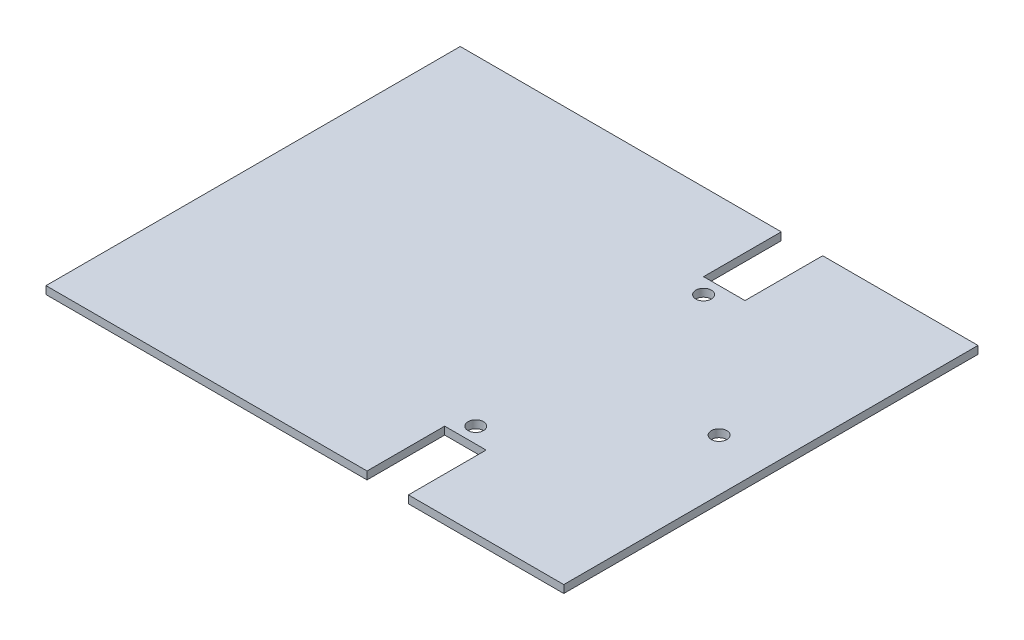
ISO-10303-21;
HEADER;
FILE_DESCRIPTION(('STEP AP214'),'2;1');
FILE_NAME('part.step','',(''),(''),'','','');
FILE_SCHEMA(('AUTOMOTIVE_DESIGN { 1 0 10303 214 1 1 1 1 }'));
ENDSEC;
DATA;
#1=APPLICATION_CONTEXT('core data for automotive mechanical design processes');
#2=APPLICATION_PROTOCOL_DEFINITION('international standard','automotive_design',2000,#1);
#3=PRODUCT_CONTEXT('',#1,'mechanical');
#4=PRODUCT('Part','Part','',(#3));
#5=PRODUCT_RELATED_PRODUCT_CATEGORY('part','',(#4));
#6=PRODUCT_DEFINITION_FORMATION('','',#4);
#7=PRODUCT_DEFINITION_CONTEXT('part definition',#1,'design');
#8=PRODUCT_DEFINITION('design','',#6,#7);
#9=PRODUCT_DEFINITION_SHAPE('','',#8);
#10=(LENGTH_UNIT() NAMED_UNIT(*) SI_UNIT(.MILLI.,.METRE.));
#11=(NAMED_UNIT(*) PLANE_ANGLE_UNIT() SI_UNIT($,.RADIAN.));
#12=(NAMED_UNIT(*) SI_UNIT($,.STERADIAN.) SOLID_ANGLE_UNIT());
#13=UNCERTAINTY_MEASURE_WITH_UNIT(LENGTH_MEASURE(1.E-05),#10,'distance_accuracy_value','');
#14=(GEOMETRIC_REPRESENTATION_CONTEXT(3) GLOBAL_UNCERTAINTY_ASSIGNED_CONTEXT((#13)) GLOBAL_UNIT_ASSIGNED_CONTEXT((#10,
#11,#12)) REPRESENTATION_CONTEXT('',''));
#15=CARTESIAN_POINT('',(0.,0.,0.));
#16=DIRECTION('',(0.,0.,1.));
#17=DIRECTION('',(1.,0.,0.));
#18=AXIS2_PLACEMENT_3D('',#15,#16,#17);
#19=CARTESIAN_POINT('',(0.,1.5,0.));
#20=DIRECTION('',(0.,0.,-1.));
#21=DIRECTION('',(-1.,0.,0.));
#22=AXIS2_PLACEMENT_3D('',#19,#20,#21);
#23=PLANE('',#22);
#24=DIRECTION('',(1.,0.,0.));
#25=VECTOR('',#24,1.);
#26=CARTESIAN_POINT('',(0.,0.,0.));
#27=LINE('',#26,#25);
#28=CARTESIAN_POINT('',(0.,0.,0.));
#29=VERTEX_POINT('',#28);
#30=CARTESIAN_POINT('',(62.,0.,0.));
#31=VERTEX_POINT('',#30);
#32=EDGE_CURVE('E137',#29,#31,#27,.T.);
#33=ORIENTED_EDGE('',*,*,#32,.T.);
#34=DIRECTION('',(0.,1.,0.));
#35=VECTOR('',#34,1.);
#36=CARTESIAN_POINT('',(62.,-0.000999999999999916,0.));
#37=LINE('',#36,#35);
#38=CARTESIAN_POINT('',(62.,1.5,0.));
#39=VERTEX_POINT('',#38);
#40=EDGE_CURVE('E120',#31,#39,#37,.T.);
#41=ORIENTED_EDGE('',*,*,#40,.T.);
#42=DIRECTION('',(1.,0.,0.));
#43=VECTOR('',#42,1.);
#44=CARTESIAN_POINT('',(0.,1.5,0.));
#45=LINE('',#44,#43);
#46=CARTESIAN_POINT('',(0.,1.5,0.));
#47=VERTEX_POINT('',#46);
#48=EDGE_CURVE('E188',#47,#39,#45,.T.);
#49=ORIENTED_EDGE('',*,*,#48,.F.);
#50=DIRECTION('',(0.,-1.,0.));
#51=VECTOR('',#50,1.);
#52=CARTESIAN_POINT('',(0.,1.5,0.));
#53=LINE('',#52,#51);
#54=EDGE_CURVE('E11',#47,#29,#53,.T.);
#55=ORIENTED_EDGE('',*,*,#54,.T.);
#56=EDGE_LOOP('',(#33,#41,#49,#55));
#57=FACE_BOUND('',#56,.T.);
#58=ADVANCED_FACE('F32',(#57),#23,.F.);
#59=CARTESIAN_POINT('',(0.,1.5,-80.));
#60=DIRECTION('',(0.,0.,1.));
#61=DIRECTION('',(1.,0.,0.));
#62=AXIS2_PLACEMENT_3D('',#59,#60,#61);
#63=PLANE('',#62);
#64=DIRECTION('',(-1.,0.,0.));
#65=VECTOR('',#64,1.);
#66=CARTESIAN_POINT('',(0.,1.5,-80.));
#67=LINE('',#66,#65);
#68=CARTESIAN_POINT('',(62.,1.5,-80.));
#69=VERTEX_POINT('',#68);
#70=CARTESIAN_POINT('',(0.,1.5,-80.));
#71=VERTEX_POINT('',#70);
#72=EDGE_CURVE('E185',#69,#71,#67,.T.);
#73=ORIENTED_EDGE('',*,*,#72,.F.);
#74=DIRECTION('',(0.,1.,0.));
#75=VECTOR('',#74,1.);
#76=CARTESIAN_POINT('',(62.,-0.000999999999999916,-80.));
#77=LINE('',#76,#75);
#78=CARTESIAN_POINT('',(62.,0.,-80.));
#79=VERTEX_POINT('',#78);
#80=EDGE_CURVE('E195',#79,#69,#77,.T.);
#81=ORIENTED_EDGE('',*,*,#80,.F.);
#82=DIRECTION('',(-1.,0.,0.));
#83=VECTOR('',#82,1.);
#84=CARTESIAN_POINT('',(0.,0.,-80.));
#85=LINE('',#84,#83);
#86=CARTESIAN_POINT('',(0.,0.,-80.));
#87=VERTEX_POINT('',#86);
#88=EDGE_CURVE('E146',#79,#87,#85,.T.);
#89=ORIENTED_EDGE('',*,*,#88,.T.);
#90=DIRECTION('',(0.,-1.,0.));
#91=VECTOR('',#90,1.);
#92=CARTESIAN_POINT('',(0.,1.5,-80.));
#93=LINE('',#92,#91);
#94=EDGE_CURVE('E156',#71,#87,#93,.T.);
#95=ORIENTED_EDGE('',*,*,#94,.F.);
#96=EDGE_LOOP('',(#73,#81,#89,#95));
#97=FACE_BOUND('',#96,.T.);
#98=ADVANCED_FACE('F261',(#97),#63,.F.);
#99=CARTESIAN_POINT('',(0.,1.5,0.));
#100=DIRECTION('',(1.,0.,0.));
#101=DIRECTION('',(0.,0.,-1.));
#102=AXIS2_PLACEMENT_3D('',#99,#100,#101);
#103=PLANE('',#102);
#104=DIRECTION('',(0.,0.,1.));
#105=VECTOR('',#104,1.);
#106=CARTESIAN_POINT('',(0.,0.,0.));
#107=LINE('',#106,#105);
#108=EDGE_CURVE('E148',#87,#29,#107,.T.);
#109=ORIENTED_EDGE('',*,*,#108,.T.);
#110=ORIENTED_EDGE('',*,*,#54,.F.);
#111=DIRECTION('',(0.,0.,1.));
#112=VECTOR('',#111,1.);
#113=CARTESIAN_POINT('',(0.,1.5,0.));
#114=LINE('',#113,#112);
#115=EDGE_CURVE('E155',#71,#47,#114,.T.);
#116=ORIENTED_EDGE('',*,*,#115,.F.);
#117=ORIENTED_EDGE('',*,*,#94,.T.);
#118=EDGE_LOOP('',(#109,#110,#116,#117));
#119=FACE_BOUND('',#118,.T.);
#120=ADVANCED_FACE('F34',(#119),#103,.F.);
#121=CARTESIAN_POINT('',(70.,1.5,0.));
#122=VERTEX_POINT('',#121);
#123=CARTESIAN_POINT('',(100.,1.5,0.));
#124=VERTEX_POINT('',#123);
#125=EDGE_CURVE('E190',#122,#124,#45,.T.);
#126=ORIENTED_EDGE('',*,*,#125,.F.);
#127=DIRECTION('',(0.,1.,0.));
#128=VECTOR('',#127,1.);
#129=CARTESIAN_POINT('',(70.,-0.000999999999999916,0.));
#130=LINE('',#129,#128);
#131=CARTESIAN_POINT('',(70.,0.,0.));
#132=VERTEX_POINT('',#131);
#133=EDGE_CURVE('E130',#132,#122,#130,.T.);
#134=ORIENTED_EDGE('',*,*,#133,.F.);
#135=CARTESIAN_POINT('',(100.,0.,0.));
#136=VERTEX_POINT('',#135);
#137=EDGE_CURVE('E144',#132,#136,#27,.T.);
#138=ORIENTED_EDGE('',*,*,#137,.T.);
#139=DIRECTION('',(0.,-1.,0.));
#140=VECTOR('',#139,1.);
#141=CARTESIAN_POINT('',(100.,1.5,0.));
#142=LINE('',#141,#140);
#143=EDGE_CURVE('E40',#124,#136,#142,.T.);
#144=ORIENTED_EDGE('',*,*,#143,.F.);
#145=EDGE_LOOP('',(#126,#134,#138,#144));
#146=FACE_BOUND('',#145,.T.);
#147=ADVANCED_FACE('F280',(#146),#23,.F.);
#148=CARTESIAN_POINT('',(100.,1.5,0.));
#149=DIRECTION('',(-1.,0.,0.));
#150=DIRECTION('',(0.,0.,1.));
#151=AXIS2_PLACEMENT_3D('',#148,#149,#150);
#152=PLANE('',#151);
#153=DIRECTION('',(0.,0.,-1.));
#154=VECTOR('',#153,1.);
#155=CARTESIAN_POINT('',(100.,0.,0.));
#156=LINE('',#155,#154);
#157=CARTESIAN_POINT('',(100.,0.,-80.));
#158=VERTEX_POINT('',#157);
#159=EDGE_CURVE('E143',#136,#158,#156,.T.);
#160=ORIENTED_EDGE('',*,*,#159,.T.);
#161=DIRECTION('',(0.,-1.,0.));
#162=VECTOR('',#161,1.);
#163=CARTESIAN_POINT('',(100.,1.5,-80.));
#164=LINE('',#163,#162);
#165=CARTESIAN_POINT('',(100.,1.5,-80.));
#166=VERTEX_POINT('',#165);
#167=EDGE_CURVE('E159',#166,#158,#164,.T.);
#168=ORIENTED_EDGE('',*,*,#167,.F.);
#169=DIRECTION('',(0.,0.,-1.));
#170=VECTOR('',#169,1.);
#171=CARTESIAN_POINT('',(100.,1.5,0.));
#172=LINE('',#171,#170);
#173=EDGE_CURVE('E169',#124,#166,#172,.T.);
#174=ORIENTED_EDGE('',*,*,#173,.F.);
#175=ORIENTED_EDGE('',*,*,#143,.T.);
#176=EDGE_LOOP('',(#160,#168,#174,#175));
#177=FACE_BOUND('',#176,.T.);
#178=ADVANCED_FACE('F167',(#177),#152,.F.);
#179=CARTESIAN_POINT('',(70.,0.,-80.));
#180=VERTEX_POINT('',#179);
#181=EDGE_CURVE('E152',#158,#180,#85,.T.);
#182=ORIENTED_EDGE('',*,*,#181,.T.);
#183=DIRECTION('',(0.,1.,0.));
#184=VECTOR('',#183,1.);
#185=CARTESIAN_POINT('',(70.,-0.000999999999999916,-80.));
#186=LINE('',#185,#184);
#187=CARTESIAN_POINT('',(70.,1.5,-80.));
#188=VERTEX_POINT('',#187);
#189=EDGE_CURVE('E181',#180,#188,#186,.T.);
#190=ORIENTED_EDGE('',*,*,#189,.T.);
#191=EDGE_CURVE('E160',#166,#188,#67,.T.);
#192=ORIENTED_EDGE('',*,*,#191,.F.);
#193=ORIENTED_EDGE('',*,*,#167,.T.);
#194=EDGE_LOOP('',(#182,#190,#192,#193));
#195=FACE_BOUND('',#194,.T.);
#196=ADVANCED_FACE('F179',(#195),#63,.F.);
#197=CARTESIAN_POINT('',(0.,1.5,0.));
#198=DIRECTION('',(0.,-1.,0.));
#199=DIRECTION('',(0.,0.,-1.));
#200=AXIS2_PLACEMENT_3D('',#197,#198,#199);
#201=PLANE('',#200);
#202=CARTESIAN_POINT('',(65.,1.5,-18.));
#203=DIRECTION('',(0.,1.,0.));
#204=DIRECTION('',(0.,0.,1.));
#205=AXIS2_PLACEMENT_3D('',#202,#203,#204);
#206=CIRCLE('',#205,1.5);
#207=CARTESIAN_POINT('',(65.,1.5,-16.5));
#208=VERTEX_POINT('',#207);
#209=EDGE_CURVE('E234',#208,#208,#206,.T.);
#210=ORIENTED_EDGE('',*,*,#209,.F.);
#211=EDGE_LOOP('',(#210));
#212=FACE_BOUND('',#211,.T.);
#213=CARTESIAN_POINT('',(90.,1.5,-40.));
#214=DIRECTION('',(0.,1.,0.));
#215=DIRECTION('',(0.,0.,1.));
#216=AXIS2_PLACEMENT_3D('',#213,#214,#215);
#217=CIRCLE('',#216,1.5);
#218=CARTESIAN_POINT('',(90.,1.5,-38.5));
#219=VERTEX_POINT('',#218);
#220=EDGE_CURVE('E228',#219,#219,#217,.T.);
#221=ORIENTED_EDGE('',*,*,#220,.F.);
#222=EDGE_LOOP('',(#221));
#223=FACE_BOUND('',#222,.T.);
#224=CARTESIAN_POINT('',(65.,1.5,-62.));
#225=DIRECTION('',(0.,1.,0.));
#226=DIRECTION('',(0.,0.,1.));
#227=AXIS2_PLACEMENT_3D('',#224,#225,#226);
#228=CIRCLE('',#227,1.5);
#229=CARTESIAN_POINT('',(65.,1.5,-60.5));
#230=VERTEX_POINT('',#229);
#231=EDGE_CURVE('E224',#230,#230,#228,.T.);
#232=ORIENTED_EDGE('',*,*,#231,.F.);
#233=EDGE_LOOP('',(#232));
#234=FACE_BOUND('',#233,.T.);
#235=ORIENTED_EDGE('',*,*,#48,.T.);
#236=DIRECTION('',(0.,0.,1.));
#237=VECTOR('',#236,1.);
#238=CARTESIAN_POINT('',(62.,1.5,0.));
#239=LINE('',#238,#237);
#240=CARTESIAN_POINT('',(62.,1.5,-15.));
#241=VERTEX_POINT('',#240);
#242=EDGE_CURVE('E126',#241,#39,#239,.T.);
#243=ORIENTED_EDGE('',*,*,#242,.F.);
#244=DIRECTION('',(-1.,0.,0.));
#245=VECTOR('',#244,1.);
#246=CARTESIAN_POINT('',(62.,1.5,-15.));
#247=LINE('',#246,#245);
#248=CARTESIAN_POINT('',(70.,1.5,-15.));
#249=VERTEX_POINT('',#248);
#250=EDGE_CURVE('E131',#249,#241,#247,.T.);
#251=ORIENTED_EDGE('',*,*,#250,.F.);
#252=DIRECTION('',(0.,0.,-1.));
#253=VECTOR('',#252,1.);
#254=CARTESIAN_POINT('',(70.,1.5,0.));
#255=LINE('',#254,#253);
#256=EDGE_CURVE('E218',#122,#249,#255,.T.);
#257=ORIENTED_EDGE('',*,*,#256,.F.);
#258=ORIENTED_EDGE('',*,*,#125,.T.);
#259=ORIENTED_EDGE('',*,*,#173,.T.);
#260=ORIENTED_EDGE('',*,*,#191,.T.);
#261=DIRECTION('',(0.,0.,-1.));
#262=VECTOR('',#261,1.);
#263=CARTESIAN_POINT('',(70.,1.5,-80.));
#264=LINE('',#263,#262);
#265=CARTESIAN_POINT('',(70.,1.5,-65.));
#266=VERTEX_POINT('',#265);
#267=EDGE_CURVE('E198',#266,#188,#264,.T.);
#268=ORIENTED_EDGE('',*,*,#267,.F.);
#269=DIRECTION('',(1.,0.,0.));
#270=VECTOR('',#269,1.);
#271=CARTESIAN_POINT('',(62.,1.5,-65.));
#272=LINE('',#271,#270);
#273=CARTESIAN_POINT('',(62.,1.5,-65.));
#274=VERTEX_POINT('',#273);
#275=EDGE_CURVE('E203',#274,#266,#272,.T.);
#276=ORIENTED_EDGE('',*,*,#275,.F.);
#277=DIRECTION('',(0.,0.,1.));
#278=VECTOR('',#277,1.);
#279=CARTESIAN_POINT('',(62.,1.5,-80.));
#280=LINE('',#279,#278);
#281=EDGE_CURVE('E205',#69,#274,#280,.T.);
#282=ORIENTED_EDGE('',*,*,#281,.F.);
#283=ORIENTED_EDGE('',*,*,#72,.T.);
#284=ORIENTED_EDGE('',*,*,#115,.T.);
#285=EDGE_LOOP('',(#235,#243,#251,#257,#258,#259,#260,#268,#276,#282,#283,#284));
#286=FACE_BOUND('',#285,.T.);
#287=ADVANCED_FACE('F245',(#212,#223,#234,#286),#201,.F.);
#288=CARTESIAN_POINT('',(0.,0.,0.));
#289=DIRECTION('',(0.,-1.,0.));
#290=DIRECTION('',(0.,0.,-1.));
#291=AXIS2_PLACEMENT_3D('',#288,#289,#290);
#292=PLANE('',#291);
#293=CARTESIAN_POINT('',(65.,0.,-18.));
#294=DIRECTION('',(0.,-1.,0.));
#295=DIRECTION('',(0.,0.,-1.));
#296=AXIS2_PLACEMENT_3D('',#293,#294,#295);
#297=CIRCLE('',#296,1.5);
#298=CARTESIAN_POINT('',(65.,0.,-19.5));
#299=VERTEX_POINT('',#298);
#300=EDGE_CURVE('E237',#299,#299,#297,.F.);
#301=ORIENTED_EDGE('',*,*,#300,.T.);
#302=EDGE_LOOP('',(#301));
#303=FACE_BOUND('',#302,.T.);
#304=CARTESIAN_POINT('',(90.,0.,-40.));
#305=DIRECTION('',(0.,-1.,0.));
#306=DIRECTION('',(0.,0.,-1.));
#307=AXIS2_PLACEMENT_3D('',#304,#305,#306);
#308=CIRCLE('',#307,1.5);
#309=CARTESIAN_POINT('',(90.,0.,-41.5));
#310=VERTEX_POINT('',#309);
#311=EDGE_CURVE('E231',#310,#310,#308,.F.);
#312=ORIENTED_EDGE('',*,*,#311,.T.);
#313=EDGE_LOOP('',(#312));
#314=FACE_BOUND('',#313,.T.);
#315=CARTESIAN_POINT('',(65.,0.,-62.));
#316=DIRECTION('',(0.,-1.,0.));
#317=DIRECTION('',(0.,0.,-1.));
#318=AXIS2_PLACEMENT_3D('',#315,#316,#317);
#319=CIRCLE('',#318,1.5);
#320=CARTESIAN_POINT('',(65.,0.,-63.5));
#321=VERTEX_POINT('',#320);
#322=EDGE_CURVE('E225',#321,#321,#319,.F.);
#323=ORIENTED_EDGE('',*,*,#322,.T.);
#324=EDGE_LOOP('',(#323));
#325=FACE_BOUND('',#324,.T.);
#326=DIRECTION('',(0.,0.,1.));
#327=VECTOR('',#326,1.);
#328=CARTESIAN_POINT('',(62.,0.,0.));
#329=LINE('',#328,#327);
#330=CARTESIAN_POINT('',(62.,0.,-15.));
#331=VERTEX_POINT('',#330);
#332=EDGE_CURVE('E123',#331,#31,#329,.T.);
#333=ORIENTED_EDGE('',*,*,#332,.T.);
#334=ORIENTED_EDGE('',*,*,#32,.F.);
#335=ORIENTED_EDGE('',*,*,#108,.F.);
#336=ORIENTED_EDGE('',*,*,#88,.F.);
#337=DIRECTION('',(0.,0.,1.));
#338=VECTOR('',#337,1.);
#339=CARTESIAN_POINT('',(62.,0.,-80.));
#340=LINE('',#339,#338);
#341=CARTESIAN_POINT('',(62.,0.,-65.));
#342=VERTEX_POINT('',#341);
#343=EDGE_CURVE('E208',#79,#342,#340,.T.);
#344=ORIENTED_EDGE('',*,*,#343,.T.);
#345=DIRECTION('',(1.,0.,0.));
#346=VECTOR('',#345,1.);
#347=CARTESIAN_POINT('',(62.,0.,-65.));
#348=LINE('',#347,#346);
#349=CARTESIAN_POINT('',(70.,0.,-65.));
#350=VERTEX_POINT('',#349);
#351=EDGE_CURVE('E193',#342,#350,#348,.T.);
#352=ORIENTED_EDGE('',*,*,#351,.T.);
#353=DIRECTION('',(0.,0.,-1.));
#354=VECTOR('',#353,1.);
#355=CARTESIAN_POINT('',(70.,0.,-80.));
#356=LINE('',#355,#354);
#357=EDGE_CURVE('E176',#350,#180,#356,.T.);
#358=ORIENTED_EDGE('',*,*,#357,.T.);
#359=ORIENTED_EDGE('',*,*,#181,.F.);
#360=ORIENTED_EDGE('',*,*,#159,.F.);
#361=ORIENTED_EDGE('',*,*,#137,.F.);
#362=DIRECTION('',(0.,0.,-1.));
#363=VECTOR('',#362,1.);
#364=CARTESIAN_POINT('',(70.,0.,0.));
#365=LINE('',#364,#363);
#366=CARTESIAN_POINT('',(70.,0.,-15.));
#367=VERTEX_POINT('',#366);
#368=EDGE_CURVE('E222',#132,#367,#365,.T.);
#369=ORIENTED_EDGE('',*,*,#368,.T.);
#370=DIRECTION('',(-1.,0.,0.));
#371=VECTOR('',#370,1.);
#372=CARTESIAN_POINT('',(62.,0.,-15.));
#373=LINE('',#372,#371);
#374=EDGE_CURVE('E139',#367,#331,#373,.T.);
#375=ORIENTED_EDGE('',*,*,#374,.T.);
#376=EDGE_LOOP('',(#333,#334,#335,#336,#344,#352,#358,#359,#360,#361,#369,#375));
#377=FACE_BOUND('',#376,.T.);
#378=ADVANCED_FACE('F135',(#303,#314,#325,#377),#292,.T.);
#379=CARTESIAN_POINT('',(62.,-0.000999999999999916,-80.));
#380=DIRECTION('',(-1.,0.,0.));
#381=DIRECTION('',(0.,0.,1.));
#382=AXIS2_PLACEMENT_3D('',#379,#380,#381);
#383=PLANE('',#382);
#384=ORIENTED_EDGE('',*,*,#80,.T.);
#385=ORIENTED_EDGE('',*,*,#281,.T.);
#386=DIRECTION('',(0.,1.,0.));
#387=VECTOR('',#386,1.);
#388=CARTESIAN_POINT('',(62.,-0.000999999999999916,-65.));
#389=LINE('',#388,#387);
#390=EDGE_CURVE('E196',#342,#274,#389,.T.);
#391=ORIENTED_EDGE('',*,*,#390,.F.);
#392=ORIENTED_EDGE('',*,*,#343,.F.);
#393=EDGE_LOOP('',(#384,#385,#391,#392));
#394=FACE_BOUND('',#393,.T.);
#395=ADVANCED_FACE('F263',(#394),#383,.F.);
#396=CARTESIAN_POINT('',(70.,-0.000999999999999916,-80.));
#397=DIRECTION('',(1.,0.,0.));
#398=DIRECTION('',(0.,0.,-1.));
#399=AXIS2_PLACEMENT_3D('',#396,#397,#398);
#400=PLANE('',#399);
#401=DIRECTION('',(0.,1.,0.));
#402=VECTOR('',#401,1.);
#403=CARTESIAN_POINT('',(70.,-0.000999999999999916,-65.));
#404=LINE('',#403,#402);
#405=EDGE_CURVE('E55',#350,#266,#404,.T.);
#406=ORIENTED_EDGE('',*,*,#405,.T.);
#407=ORIENTED_EDGE('',*,*,#267,.T.);
#408=ORIENTED_EDGE('',*,*,#189,.F.);
#409=ORIENTED_EDGE('',*,*,#357,.F.);
#410=EDGE_LOOP('',(#406,#407,#408,#409));
#411=FACE_BOUND('',#410,.T.);
#412=ADVANCED_FACE('F268',(#411),#400,.F.);
#413=CARTESIAN_POINT('',(62.,-0.000999999999999916,-65.));
#414=DIRECTION('',(0.,0.,1.));
#415=DIRECTION('',(1.,0.,0.));
#416=AXIS2_PLACEMENT_3D('',#413,#414,#415);
#417=PLANE('',#416);
#418=ORIENTED_EDGE('',*,*,#390,.T.);
#419=ORIENTED_EDGE('',*,*,#275,.T.);
#420=ORIENTED_EDGE('',*,*,#405,.F.);
#421=ORIENTED_EDGE('',*,*,#351,.F.);
#422=EDGE_LOOP('',(#418,#419,#420,#421));
#423=FACE_BOUND('',#422,.T.);
#424=ADVANCED_FACE('F266',(#423),#417,.F.);
#425=CARTESIAN_POINT('',(62.,-0.000999999999999916,0.));
#426=DIRECTION('',(-1.,0.,0.));
#427=DIRECTION('',(0.,0.,1.));
#428=AXIS2_PLACEMENT_3D('',#425,#426,#427);
#429=PLANE('',#428);
#430=DIRECTION('',(0.,1.,0.));
#431=VECTOR('',#430,1.);
#432=CARTESIAN_POINT('',(62.,-0.000999999999999916,-15.));
#433=LINE('',#432,#431);
#434=EDGE_CURVE('E211',#331,#241,#433,.T.);
#435=ORIENTED_EDGE('',*,*,#434,.T.);
#436=ORIENTED_EDGE('',*,*,#242,.T.);
#437=ORIENTED_EDGE('',*,*,#40,.F.);
#438=ORIENTED_EDGE('',*,*,#332,.F.);
#439=EDGE_LOOP('',(#435,#436,#437,#438));
#440=FACE_BOUND('',#439,.T.);
#441=ADVANCED_FACE('F122',(#440),#429,.F.);
#442=CARTESIAN_POINT('',(62.,-0.000999999999999916,-15.));
#443=DIRECTION('',(0.,0.,-1.));
#444=DIRECTION('',(-1.,0.,0.));
#445=AXIS2_PLACEMENT_3D('',#442,#443,#444);
#446=PLANE('',#445);
#447=DIRECTION('',(0.,1.,0.));
#448=VECTOR('',#447,1.);
#449=CARTESIAN_POINT('',(70.,-0.000999999999999916,-15.));
#450=LINE('',#449,#448);
#451=EDGE_CURVE('E47',#367,#249,#450,.T.);
#452=ORIENTED_EDGE('',*,*,#451,.T.);
#453=ORIENTED_EDGE('',*,*,#250,.T.);
#454=ORIENTED_EDGE('',*,*,#434,.F.);
#455=ORIENTED_EDGE('',*,*,#374,.F.);
#456=EDGE_LOOP('',(#452,#453,#454,#455));
#457=FACE_BOUND('',#456,.T.);
#458=ADVANCED_FACE('F274',(#457),#446,.F.);
#459=CARTESIAN_POINT('',(70.,-0.000999999999999916,0.));
#460=DIRECTION('',(1.,0.,0.));
#461=DIRECTION('',(0.,0.,-1.));
#462=AXIS2_PLACEMENT_3D('',#459,#460,#461);
#463=PLANE('',#462);
#464=ORIENTED_EDGE('',*,*,#133,.T.);
#465=ORIENTED_EDGE('',*,*,#256,.T.);
#466=ORIENTED_EDGE('',*,*,#451,.F.);
#467=ORIENTED_EDGE('',*,*,#368,.F.);
#468=EDGE_LOOP('',(#464,#465,#466,#467));
#469=FACE_BOUND('',#468,.T.);
#470=ADVANCED_FACE('F293',(#469),#463,.F.);
#471=CARTESIAN_POINT('',(65.,-0.000999999999999916,-62.));
#472=DIRECTION('',(0.,1.,0.));
#473=DIRECTION('',(0.,0.,1.));
#474=AXIS2_PLACEMENT_3D('',#471,#472,#473);
#475=CYLINDRICAL_SURFACE('',#474,1.5);
#476=ORIENTED_EDGE('',*,*,#322,.F.);
#477=EDGE_LOOP('',(#476));
#478=FACE_BOUND('',#477,.T.);
#479=ORIENTED_EDGE('',*,*,#231,.T.);
#480=EDGE_LOOP('',(#479));
#481=FACE_BOUND('',#480,.T.);
#482=ADVANCED_FACE('F295',(#478,#481),#475,.F.);
#483=CARTESIAN_POINT('',(90.,-0.000999999999999916,-40.));
#484=DIRECTION('',(0.,1.,0.));
#485=DIRECTION('',(0.,0.,1.));
#486=AXIS2_PLACEMENT_3D('',#483,#484,#485);
#487=CYLINDRICAL_SURFACE('',#486,1.5);
#488=ORIENTED_EDGE('',*,*,#311,.F.);
#489=EDGE_LOOP('',(#488));
#490=FACE_BOUND('',#489,.T.);
#491=ORIENTED_EDGE('',*,*,#220,.T.);
#492=EDGE_LOOP('',(#491));
#493=FACE_BOUND('',#492,.T.);
#494=ADVANCED_FACE('F301',(#490,#493),#487,.F.);
#495=CARTESIAN_POINT('',(65.,-0.000999999999999916,-18.));
#496=DIRECTION('',(0.,1.,0.));
#497=DIRECTION('',(0.,0.,1.));
#498=AXIS2_PLACEMENT_3D('',#495,#496,#497);
#499=CYLINDRICAL_SURFACE('',#498,1.5);
#500=ORIENTED_EDGE('',*,*,#300,.F.);
#501=EDGE_LOOP('',(#500));
#502=FACE_BOUND('',#501,.T.);
#503=ORIENTED_EDGE('',*,*,#209,.T.);
#504=EDGE_LOOP('',(#503));
#505=FACE_BOUND('',#504,.T.);
#506=ADVANCED_FACE('F243',(#502,#505),#499,.F.);
#507=CLOSED_SHELL('',(#58,#98,#120,#147,#178,#196,#287,#378,#395,#412,#424,#441,#458,#470,#482,
#494,#506));
#508=MANIFOLD_SOLID_BREP('B2',#507);
#509=ADVANCED_BREP_SHAPE_REPRESENTATION('',(#18,#508),#14);
#510=SHAPE_DEFINITION_REPRESENTATION(#9,#509);
ENDSEC;
END-ISO-10303-21;
